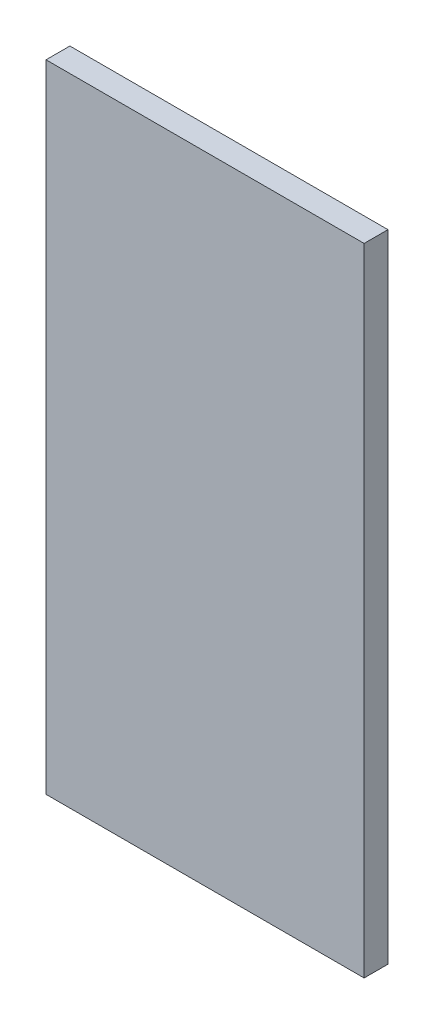
ISO-10303-21;
HEADER;
FILE_DESCRIPTION(('STEP AP214'),'2;1');
FILE_NAME('part.step','',(''),(''),'','','');
FILE_SCHEMA(('AUTOMOTIVE_DESIGN { 1 0 10303 214 1 1 1 1 }'));
ENDSEC;
DATA;
#1=APPLICATION_CONTEXT('core data for automotive mechanical design processes');
#2=APPLICATION_PROTOCOL_DEFINITION('international standard','automotive_design',2000,#1);
#3=PRODUCT_CONTEXT('',#1,'mechanical');
#4=PRODUCT('Part','Part','',(#3));
#5=PRODUCT_RELATED_PRODUCT_CATEGORY('part','',(#4));
#6=PRODUCT_DEFINITION_FORMATION('','',#4);
#7=PRODUCT_DEFINITION_CONTEXT('part definition',#1,'design');
#8=PRODUCT_DEFINITION('design','',#6,#7);
#9=PRODUCT_DEFINITION_SHAPE('','',#8);
#10=(LENGTH_UNIT() NAMED_UNIT(*) SI_UNIT(.MILLI.,.METRE.));
#11=(NAMED_UNIT(*) PLANE_ANGLE_UNIT() SI_UNIT($,.RADIAN.));
#12=(NAMED_UNIT(*) SI_UNIT($,.STERADIAN.) SOLID_ANGLE_UNIT());
#13=UNCERTAINTY_MEASURE_WITH_UNIT(LENGTH_MEASURE(1.E-05),#10,'distance_accuracy_value','');
#14=(GEOMETRIC_REPRESENTATION_CONTEXT(3) GLOBAL_UNCERTAINTY_ASSIGNED_CONTEXT((#13)) GLOBAL_UNIT_ASSIGNED_CONTEXT((#10,
#11,#12)) REPRESENTATION_CONTEXT('',''));
#15=CARTESIAN_POINT('',(0.,0.,0.));
#16=DIRECTION('',(0.,0.,1.));
#17=DIRECTION('',(1.,0.,0.));
#18=AXIS2_PLACEMENT_3D('',#15,#16,#17);
#19=CARTESIAN_POINT('',(10.,-20.,1.5));
#20=DIRECTION('',(-1.,0.,0.));
#21=DIRECTION('',(0.,0.,1.));
#22=AXIS2_PLACEMENT_3D('',#19,#20,#21);
#23=PLANE('',#22);
#24=DIRECTION('',(0.,1.,0.));
#25=VECTOR('',#24,1.);
#26=CARTESIAN_POINT('',(10.,-20.,0.));
#27=LINE('',#26,#25);
#28=CARTESIAN_POINT('',(10.,-20.,0.));
#29=VERTEX_POINT('',#28);
#30=CARTESIAN_POINT('',(10.,20.,0.));
#31=VERTEX_POINT('',#30);
#32=EDGE_CURVE('E96',#29,#31,#27,.T.);
#33=ORIENTED_EDGE('',*,*,#32,.T.);
#34=DIRECTION('',(0.,0.,-1.));
#35=VECTOR('',#34,1.);
#36=CARTESIAN_POINT('',(10.,20.,1.5));
#37=LINE('',#36,#35);
#38=CARTESIAN_POINT('',(10.,20.,1.5));
#39=VERTEX_POINT('',#38);
#40=EDGE_CURVE('E11',#39,#31,#37,.T.);
#41=ORIENTED_EDGE('',*,*,#40,.F.);
#42=DIRECTION('',(0.,1.,0.));
#43=VECTOR('',#42,1.);
#44=CARTESIAN_POINT('',(10.,-20.,1.5));
#45=LINE('',#44,#43);
#46=CARTESIAN_POINT('',(10.,-20.,1.5));
#47=VERTEX_POINT('',#46);
#48=EDGE_CURVE('E84',#47,#39,#45,.T.);
#49=ORIENTED_EDGE('',*,*,#48,.F.);
#50=DIRECTION('',(0.,0.,-1.));
#51=VECTOR('',#50,1.);
#52=CARTESIAN_POINT('',(10.,-20.,1.5));
#53=LINE('',#52,#51);
#54=EDGE_CURVE('E92',#47,#29,#53,.T.);
#55=ORIENTED_EDGE('',*,*,#54,.T.);
#56=EDGE_LOOP('',(#33,#41,#49,#55));
#57=FACE_BOUND('',#56,.T.);
#58=ADVANCED_FACE('F33',(#57),#23,.F.);
#59=CARTESIAN_POINT('',(-10.,20.,1.5));
#60=DIRECTION('',(0.,-1.,0.));
#61=DIRECTION('',(0.,0.,-1.));
#62=AXIS2_PLACEMENT_3D('',#59,#60,#61);
#63=PLANE('',#62);
#64=DIRECTION('',(-1.,0.,0.));
#65=VECTOR('',#64,1.);
#66=CARTESIAN_POINT('',(-10.,20.,0.));
#67=LINE('',#66,#65);
#68=CARTESIAN_POINT('',(-10.,20.,0.));
#69=VERTEX_POINT('',#68);
#70=EDGE_CURVE('E88',#31,#69,#67,.T.);
#71=ORIENTED_EDGE('',*,*,#70,.T.);
#72=DIRECTION('',(0.,0.,-1.));
#73=VECTOR('',#72,1.);
#74=CARTESIAN_POINT('',(-10.,20.,1.5));
#75=LINE('',#74,#73);
#76=CARTESIAN_POINT('',(-10.,20.,1.5));
#77=VERTEX_POINT('',#76);
#78=EDGE_CURVE('E41',#77,#69,#75,.T.);
#79=ORIENTED_EDGE('',*,*,#78,.F.);
#80=DIRECTION('',(-1.,0.,0.));
#81=VECTOR('',#80,1.);
#82=CARTESIAN_POINT('',(-10.,20.,1.5));
#83=LINE('',#82,#81);
#84=EDGE_CURVE('E79',#39,#77,#83,.T.);
#85=ORIENTED_EDGE('',*,*,#84,.F.);
#86=ORIENTED_EDGE('',*,*,#40,.T.);
#87=EDGE_LOOP('',(#71,#79,#85,#86));
#88=FACE_BOUND('',#87,.T.);
#89=ADVANCED_FACE('F87',(#88),#63,.F.);
#90=CARTESIAN_POINT('',(-10.,-20.,1.5));
#91=DIRECTION('',(1.,0.,0.));
#92=DIRECTION('',(0.,0.,-1.));
#93=AXIS2_PLACEMENT_3D('',#90,#91,#92);
#94=PLANE('',#93);
#95=DIRECTION('',(0.,-1.,0.));
#96=VECTOR('',#95,1.);
#97=CARTESIAN_POINT('',(-10.,-20.,0.));
#98=LINE('',#97,#96);
#99=CARTESIAN_POINT('',(-10.,-20.,0.));
#100=VERTEX_POINT('',#99);
#101=EDGE_CURVE('E66',#69,#100,#98,.T.);
#102=ORIENTED_EDGE('',*,*,#101,.T.);
#103=DIRECTION('',(0.,0.,-1.));
#104=VECTOR('',#103,1.);
#105=CARTESIAN_POINT('',(-10.,-20.,1.5));
#106=LINE('',#105,#104);
#107=CARTESIAN_POINT('',(-10.,-20.,1.5));
#108=VERTEX_POINT('',#107);
#109=EDGE_CURVE('E89',#108,#100,#106,.T.);
#110=ORIENTED_EDGE('',*,*,#109,.F.);
#111=DIRECTION('',(0.,-1.,0.));
#112=VECTOR('',#111,1.);
#113=CARTESIAN_POINT('',(-10.,-20.,1.5));
#114=LINE('',#113,#112);
#115=EDGE_CURVE('E82',#77,#108,#114,.T.);
#116=ORIENTED_EDGE('',*,*,#115,.F.);
#117=ORIENTED_EDGE('',*,*,#78,.T.);
#118=EDGE_LOOP('',(#102,#110,#116,#117));
#119=FACE_BOUND('',#118,.T.);
#120=ADVANCED_FACE('F90',(#119),#94,.F.);
#121=CARTESIAN_POINT('',(-10.,-20.,1.5));
#122=DIRECTION('',(0.,1.,0.));
#123=DIRECTION('',(0.,0.,1.));
#124=AXIS2_PLACEMENT_3D('',#121,#122,#123);
#125=PLANE('',#124);
#126=DIRECTION('',(1.,0.,0.));
#127=VECTOR('',#126,1.);
#128=CARTESIAN_POINT('',(-10.,-20.,0.));
#129=LINE('',#128,#127);
#130=EDGE_CURVE('E72',#100,#29,#129,.T.);
#131=ORIENTED_EDGE('',*,*,#130,.T.);
#132=ORIENTED_EDGE('',*,*,#54,.F.);
#133=DIRECTION('',(1.,0.,0.));
#134=VECTOR('',#133,1.);
#135=CARTESIAN_POINT('',(-10.,-20.,1.5));
#136=LINE('',#135,#134);
#137=EDGE_CURVE('E49',#108,#47,#136,.T.);
#138=ORIENTED_EDGE('',*,*,#137,.F.);
#139=ORIENTED_EDGE('',*,*,#109,.T.);
#140=EDGE_LOOP('',(#131,#132,#138,#139));
#141=FACE_BOUND('',#140,.T.);
#142=ADVANCED_FACE('F103',(#141),#125,.F.);
#143=CARTESIAN_POINT('',(0.,0.,1.5));
#144=DIRECTION('',(0.,0.,-1.));
#145=DIRECTION('',(-1.,0.,0.));
#146=AXIS2_PLACEMENT_3D('',#143,#144,#145);
#147=PLANE('',#146);
#148=ORIENTED_EDGE('',*,*,#48,.T.);
#149=ORIENTED_EDGE('',*,*,#84,.T.);
#150=ORIENTED_EDGE('',*,*,#115,.T.);
#151=ORIENTED_EDGE('',*,*,#137,.T.);
#152=EDGE_LOOP('',(#148,#149,#150,#151));
#153=FACE_BOUND('',#152,.T.);
#154=ADVANCED_FACE('F80',(#153),#147,.F.);
#155=CARTESIAN_POINT('',(0.,0.,0.));
#156=DIRECTION('',(0.,0.,-1.));
#157=DIRECTION('',(-1.,0.,0.));
#158=AXIS2_PLACEMENT_3D('',#155,#156,#157);
#159=PLANE('',#158);
#160=ORIENTED_EDGE('',*,*,#32,.F.);
#161=ORIENTED_EDGE('',*,*,#130,.F.);
#162=ORIENTED_EDGE('',*,*,#101,.F.);
#163=ORIENTED_EDGE('',*,*,#70,.F.);
#164=EDGE_LOOP('',(#160,#161,#162,#163));
#165=FACE_BOUND('',#164,.T.);
#166=ADVANCED_FACE('F106',(#165),#159,.T.);
#167=CLOSED_SHELL('',(#58,#89,#120,#142,#154,#166));
#168=MANIFOLD_SOLID_BREP('B2',#167);
#169=ADVANCED_BREP_SHAPE_REPRESENTATION('',(#18,#168),#14);
#170=SHAPE_DEFINITION_REPRESENTATION(#9,#169);
ENDSEC;
END-ISO-10303-21;
